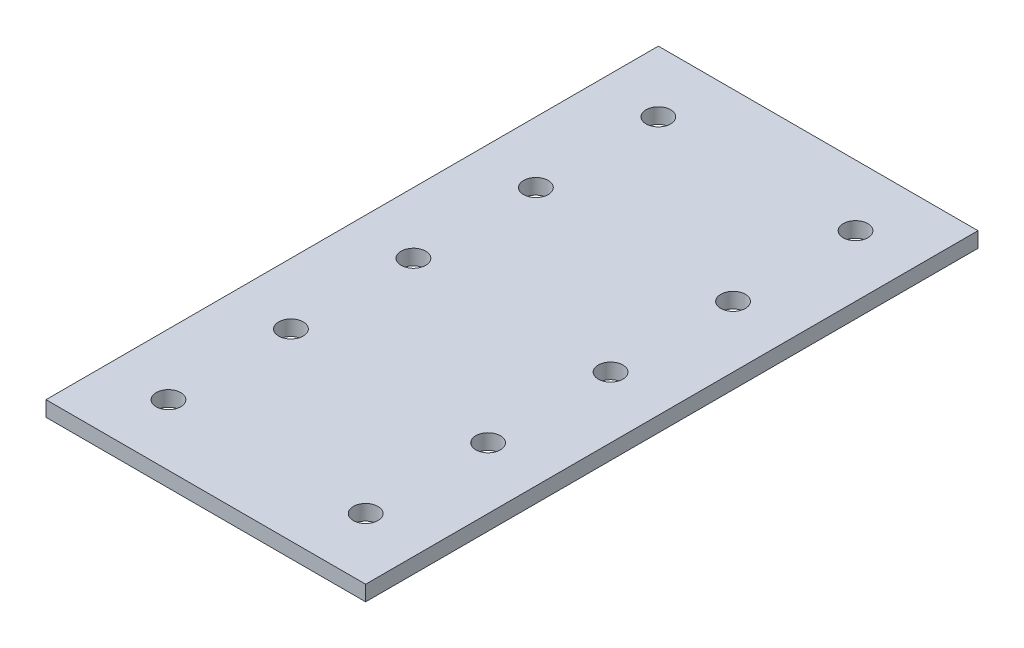
ISO-10303-21;
HEADER;
FILE_DESCRIPTION(('STEP AP214'),'2;1');
FILE_NAME('part.step','',(''),(''),'','','');
FILE_SCHEMA(('AUTOMOTIVE_DESIGN { 1 0 10303 214 1 1 1 1 }'));
ENDSEC;
DATA;
#1=APPLICATION_CONTEXT('core data for automotive mechanical design processes');
#2=APPLICATION_PROTOCOL_DEFINITION('international standard','automotive_design',2000,#1);
#3=PRODUCT_CONTEXT('',#1,'mechanical');
#4=PRODUCT('Part','Part','',(#3));
#5=PRODUCT_RELATED_PRODUCT_CATEGORY('part','',(#4));
#6=PRODUCT_DEFINITION_FORMATION('','',#4);
#7=PRODUCT_DEFINITION_CONTEXT('part definition',#1,'design');
#8=PRODUCT_DEFINITION('design','',#6,#7);
#9=PRODUCT_DEFINITION_SHAPE('','',#8);
#10=(LENGTH_UNIT() NAMED_UNIT(*) SI_UNIT(.MILLI.,.METRE.));
#11=(NAMED_UNIT(*) PLANE_ANGLE_UNIT() SI_UNIT($,.RADIAN.));
#12=(NAMED_UNIT(*) SI_UNIT($,.STERADIAN.) SOLID_ANGLE_UNIT());
#13=UNCERTAINTY_MEASURE_WITH_UNIT(LENGTH_MEASURE(1.E-05),#10,'distance_accuracy_value','');
#14=(GEOMETRIC_REPRESENTATION_CONTEXT(3) GLOBAL_UNCERTAINTY_ASSIGNED_CONTEXT((#13)) GLOBAL_UNIT_ASSIGNED_CONTEXT((#10,
#11,#12)) REPRESENTATION_CONTEXT('',''));
#15=CARTESIAN_POINT('',(0.,0.,0.));
#16=DIRECTION('',(0.,0.,1.));
#17=DIRECTION('',(1.,0.,0.));
#18=AXIS2_PLACEMENT_3D('',#15,#16,#17);
#19=CARTESIAN_POINT('',(20.447,0.,-50.8));
#20=DIRECTION('',(0.,1.,0.));
#21=DIRECTION('',(0.,0.,1.));
#22=AXIS2_PLACEMENT_3D('',#19,#20,#21);
#23=CYLINDRICAL_SURFACE('',#22,2.5527);
#24=CARTESIAN_POINT('',(20.447,0.,-50.8));
#25=DIRECTION('',(0.,1.,0.));
#26=DIRECTION('',(0.,0.,1.));
#27=AXIS2_PLACEMENT_3D('',#24,#25,#26);
#28=CIRCLE('',#27,2.5527);
#29=CARTESIAN_POINT('',(20.447,0.,-48.2473));
#30=VERTEX_POINT('',#29);
#31=EDGE_CURVE('E45',#30,#30,#28,.T.);
#32=ORIENTED_EDGE('',*,*,#31,.F.);
#33=EDGE_LOOP('',(#32));
#34=FACE_BOUND('',#33,.T.);
#35=CARTESIAN_POINT('',(20.447,3.175,-50.8));
#36=DIRECTION('',(0.,1.,0.));
#37=DIRECTION('',(0.,0.,1.));
#38=AXIS2_PLACEMENT_3D('',#35,#36,#37);
#39=CIRCLE('',#38,2.5527);
#40=CARTESIAN_POINT('',(20.447,3.175,-48.2473));
#41=VERTEX_POINT('',#40);
#42=EDGE_CURVE('E11',#41,#41,#39,.T.);
#43=ORIENTED_EDGE('',*,*,#42,.T.);
#44=EDGE_LOOP('',(#43));
#45=FACE_BOUND('',#44,.T.);
#46=ADVANCED_FACE('F37',(#34,#45),#23,.F.);
#47=CARTESIAN_POINT('',(-20.447,0.,-50.8));
#48=DIRECTION('',(0.,1.,0.));
#49=DIRECTION('',(0.,0.,1.));
#50=AXIS2_PLACEMENT_3D('',#47,#48,#49);
#51=CYLINDRICAL_SURFACE('',#50,2.5527);
#52=CARTESIAN_POINT('',(-20.447,0.,-50.8));
#53=DIRECTION('',(0.,1.,0.));
#54=DIRECTION('',(0.,0.,1.));
#55=AXIS2_PLACEMENT_3D('',#52,#53,#54);
#56=CIRCLE('',#55,2.5527);
#57=CARTESIAN_POINT('',(-20.447,0.,-48.2473));
#58=VERTEX_POINT('',#57);
#59=EDGE_CURVE('E151',#58,#58,#56,.T.);
#60=ORIENTED_EDGE('',*,*,#59,.F.);
#61=EDGE_LOOP('',(#60));
#62=FACE_BOUND('',#61,.T.);
#63=CARTESIAN_POINT('',(-20.447,3.175,-50.8));
#64=DIRECTION('',(0.,1.,0.));
#65=DIRECTION('',(0.,0.,1.));
#66=AXIS2_PLACEMENT_3D('',#63,#64,#65);
#67=CIRCLE('',#66,2.5527);
#68=CARTESIAN_POINT('',(-20.447,3.175,-48.2473));
#69=VERTEX_POINT('',#68);
#70=EDGE_CURVE('E154',#69,#69,#67,.T.);
#71=ORIENTED_EDGE('',*,*,#70,.T.);
#72=EDGE_LOOP('',(#71));
#73=FACE_BOUND('',#72,.T.);
#74=ADVANCED_FACE('F163',(#62,#73),#51,.F.);
#75=CARTESIAN_POINT('',(20.447,0.,-25.4));
#76=DIRECTION('',(0.,1.,0.));
#77=DIRECTION('',(0.,0.,1.));
#78=AXIS2_PLACEMENT_3D('',#75,#76,#77);
#79=CYLINDRICAL_SURFACE('',#78,2.5527);
#80=CARTESIAN_POINT('',(20.447,0.,-25.4));
#81=DIRECTION('',(0.,1.,0.));
#82=DIRECTION('',(0.,0.,1.));
#83=AXIS2_PLACEMENT_3D('',#80,#81,#82);
#84=CIRCLE('',#83,2.5527);
#85=CARTESIAN_POINT('',(20.447,0.,-22.8473));
#86=VERTEX_POINT('',#85);
#87=EDGE_CURVE('E145',#86,#86,#84,.T.);
#88=ORIENTED_EDGE('',*,*,#87,.F.);
#89=EDGE_LOOP('',(#88));
#90=FACE_BOUND('',#89,.T.);
#91=CARTESIAN_POINT('',(20.447,3.175,-25.4));
#92=DIRECTION('',(0.,1.,0.));
#93=DIRECTION('',(0.,0.,1.));
#94=AXIS2_PLACEMENT_3D('',#91,#92,#93);
#95=CIRCLE('',#94,2.5527);
#96=CARTESIAN_POINT('',(20.447,3.175,-22.8473));
#97=VERTEX_POINT('',#96);
#98=EDGE_CURVE('E148',#97,#97,#95,.T.);
#99=ORIENTED_EDGE('',*,*,#98,.T.);
#100=EDGE_LOOP('',(#99));
#101=FACE_BOUND('',#100,.T.);
#102=ADVANCED_FACE('F210',(#90,#101),#79,.F.);
#103=CARTESIAN_POINT('',(-20.447,0.,-25.4));
#104=DIRECTION('',(0.,1.,0.));
#105=DIRECTION('',(0.,0.,1.));
#106=AXIS2_PLACEMENT_3D('',#103,#104,#105);
#107=CYLINDRICAL_SURFACE('',#106,2.5527);
#108=CARTESIAN_POINT('',(-20.447,0.,-25.4));
#109=DIRECTION('',(0.,1.,0.));
#110=DIRECTION('',(0.,0.,1.));
#111=AXIS2_PLACEMENT_3D('',#108,#109,#110);
#112=CIRCLE('',#111,2.5527);
#113=CARTESIAN_POINT('',(-20.447,0.,-22.8473));
#114=VERTEX_POINT('',#113);
#115=EDGE_CURVE('E139',#114,#114,#112,.T.);
#116=ORIENTED_EDGE('',*,*,#115,.F.);
#117=EDGE_LOOP('',(#116));
#118=FACE_BOUND('',#117,.T.);
#119=CARTESIAN_POINT('',(-20.447,3.175,-25.4));
#120=DIRECTION('',(0.,1.,0.));
#121=DIRECTION('',(0.,0.,1.));
#122=AXIS2_PLACEMENT_3D('',#119,#120,#121);
#123=CIRCLE('',#122,2.5527);
#124=CARTESIAN_POINT('',(-20.447,3.175,-22.8473));
#125=VERTEX_POINT('',#124);
#126=EDGE_CURVE('E142',#125,#125,#123,.T.);
#127=ORIENTED_EDGE('',*,*,#126,.T.);
#128=EDGE_LOOP('',(#127));
#129=FACE_BOUND('',#128,.T.);
#130=ADVANCED_FACE('F206',(#118,#129),#107,.F.);
#131=CARTESIAN_POINT('',(20.447,0.,0.));
#132=DIRECTION('',(0.,1.,0.));
#133=DIRECTION('',(0.,0.,1.));
#134=AXIS2_PLACEMENT_3D('',#131,#132,#133);
#135=CYLINDRICAL_SURFACE('',#134,2.5527);
#136=CARTESIAN_POINT('',(20.447,0.,0.));
#137=DIRECTION('',(0.,1.,0.));
#138=DIRECTION('',(0.,0.,1.));
#139=AXIS2_PLACEMENT_3D('',#136,#137,#138);
#140=CIRCLE('',#139,2.5527);
#141=CARTESIAN_POINT('',(20.447,0.,2.5527));
#142=VERTEX_POINT('',#141);
#143=EDGE_CURVE('E133',#142,#142,#140,.T.);
#144=ORIENTED_EDGE('',*,*,#143,.F.);
#145=EDGE_LOOP('',(#144));
#146=FACE_BOUND('',#145,.T.);
#147=CARTESIAN_POINT('',(20.447,3.175,0.));
#148=DIRECTION('',(0.,1.,0.));
#149=DIRECTION('',(0.,0.,1.));
#150=AXIS2_PLACEMENT_3D('',#147,#148,#149);
#151=CIRCLE('',#150,2.5527);
#152=CARTESIAN_POINT('',(20.447,3.175,2.5527));
#153=VERTEX_POINT('',#152);
#154=EDGE_CURVE('E136',#153,#153,#151,.T.);
#155=ORIENTED_EDGE('',*,*,#154,.T.);
#156=EDGE_LOOP('',(#155));
#157=FACE_BOUND('',#156,.T.);
#158=ADVANCED_FACE('F202',(#146,#157),#135,.F.);
#159=CARTESIAN_POINT('',(-20.447,0.,0.));
#160=DIRECTION('',(0.,1.,0.));
#161=DIRECTION('',(0.,0.,1.));
#162=AXIS2_PLACEMENT_3D('',#159,#160,#161);
#163=CYLINDRICAL_SURFACE('',#162,2.5527);
#164=CARTESIAN_POINT('',(-20.447,0.,0.));
#165=DIRECTION('',(0.,1.,0.));
#166=DIRECTION('',(0.,0.,1.));
#167=AXIS2_PLACEMENT_3D('',#164,#165,#166);
#168=CIRCLE('',#167,2.5527);
#169=CARTESIAN_POINT('',(-20.447,0.,2.5527));
#170=VERTEX_POINT('',#169);
#171=EDGE_CURVE('E127',#170,#170,#168,.T.);
#172=ORIENTED_EDGE('',*,*,#171,.F.);
#173=EDGE_LOOP('',(#172));
#174=FACE_BOUND('',#173,.T.);
#175=CARTESIAN_POINT('',(-20.447,3.175,0.));
#176=DIRECTION('',(0.,1.,0.));
#177=DIRECTION('',(0.,0.,1.));
#178=AXIS2_PLACEMENT_3D('',#175,#176,#177);
#179=CIRCLE('',#178,2.5527);
#180=CARTESIAN_POINT('',(-20.447,3.175,2.5527));
#181=VERTEX_POINT('',#180);
#182=EDGE_CURVE('E130',#181,#181,#179,.T.);
#183=ORIENTED_EDGE('',*,*,#182,.T.);
#184=EDGE_LOOP('',(#183));
#185=FACE_BOUND('',#184,.T.);
#186=ADVANCED_FACE('F198',(#174,#185),#163,.F.);
#187=CARTESIAN_POINT('',(20.447,0.,25.4));
#188=DIRECTION('',(0.,1.,0.));
#189=DIRECTION('',(0.,0.,1.));
#190=AXIS2_PLACEMENT_3D('',#187,#188,#189);
#191=CYLINDRICAL_SURFACE('',#190,2.5527);
#192=CARTESIAN_POINT('',(20.447,0.,25.4));
#193=DIRECTION('',(0.,1.,0.));
#194=DIRECTION('',(0.,0.,1.));
#195=AXIS2_PLACEMENT_3D('',#192,#193,#194);
#196=CIRCLE('',#195,2.5527);
#197=CARTESIAN_POINT('',(20.447,0.,27.9527));
#198=VERTEX_POINT('',#197);
#199=EDGE_CURVE('E121',#198,#198,#196,.T.);
#200=ORIENTED_EDGE('',*,*,#199,.F.);
#201=EDGE_LOOP('',(#200));
#202=FACE_BOUND('',#201,.T.);
#203=CARTESIAN_POINT('',(20.447,3.175,25.4));
#204=DIRECTION('',(0.,1.,0.));
#205=DIRECTION('',(0.,0.,1.));
#206=AXIS2_PLACEMENT_3D('',#203,#204,#205);
#207=CIRCLE('',#206,2.5527);
#208=CARTESIAN_POINT('',(20.447,3.175,27.9527));
#209=VERTEX_POINT('',#208);
#210=EDGE_CURVE('E124',#209,#209,#207,.T.);
#211=ORIENTED_EDGE('',*,*,#210,.T.);
#212=EDGE_LOOP('',(#211));
#213=FACE_BOUND('',#212,.T.);
#214=ADVANCED_FACE('F194',(#202,#213),#191,.F.);
#215=CARTESIAN_POINT('',(-20.447,0.,25.4));
#216=DIRECTION('',(0.,1.,0.));
#217=DIRECTION('',(0.,0.,1.));
#218=AXIS2_PLACEMENT_3D('',#215,#216,#217);
#219=CYLINDRICAL_SURFACE('',#218,2.5527);
#220=CARTESIAN_POINT('',(-20.447,0.,25.4));
#221=DIRECTION('',(0.,1.,0.));
#222=DIRECTION('',(0.,0.,1.));
#223=AXIS2_PLACEMENT_3D('',#220,#221,#222);
#224=CIRCLE('',#223,2.5527);
#225=CARTESIAN_POINT('',(-20.447,0.,27.9527));
#226=VERTEX_POINT('',#225);
#227=EDGE_CURVE('E115',#226,#226,#224,.T.);
#228=ORIENTED_EDGE('',*,*,#227,.F.);
#229=EDGE_LOOP('',(#228));
#230=FACE_BOUND('',#229,.T.);
#231=CARTESIAN_POINT('',(-20.447,3.175,25.4));
#232=DIRECTION('',(0.,1.,0.));
#233=DIRECTION('',(0.,0.,1.));
#234=AXIS2_PLACEMENT_3D('',#231,#232,#233);
#235=CIRCLE('',#234,2.5527);
#236=CARTESIAN_POINT('',(-20.447,3.175,27.9527));
#237=VERTEX_POINT('',#236);
#238=EDGE_CURVE('E118',#237,#237,#235,.T.);
#239=ORIENTED_EDGE('',*,*,#238,.T.);
#240=EDGE_LOOP('',(#239));
#241=FACE_BOUND('',#240,.T.);
#242=ADVANCED_FACE('F190',(#230,#241),#219,.F.);
#243=CARTESIAN_POINT('',(33.147,3.175,63.5));
#244=DIRECTION('',(-1.,0.,0.));
#245=DIRECTION('',(0.,0.,1.));
#246=AXIS2_PLACEMENT_3D('',#243,#244,#245);
#247=PLANE('',#246);
#248=DIRECTION('',(0.,0.,-1.));
#249=VECTOR('',#248,1.);
#250=CARTESIAN_POINT('',(33.147,0.,63.5));
#251=LINE('',#250,#249);
#252=CARTESIAN_POINT('',(33.147,0.,63.5));
#253=VERTEX_POINT('',#252);
#254=CARTESIAN_POINT('',(33.147,0.,-63.5));
#255=VERTEX_POINT('',#254);
#256=EDGE_CURVE('E105',#253,#255,#251,.T.);
#257=ORIENTED_EDGE('',*,*,#256,.T.);
#258=DIRECTION('',(0.,-1.,0.));
#259=VECTOR('',#258,1.);
#260=CARTESIAN_POINT('',(33.147,3.175,-63.5));
#261=LINE('',#260,#259);
#262=CARTESIAN_POINT('',(33.147,3.175,-63.5));
#263=VERTEX_POINT('',#262);
#264=EDGE_CURVE('E96',#263,#255,#261,.T.);
#265=ORIENTED_EDGE('',*,*,#264,.F.);
#266=DIRECTION('',(0.,0.,-1.));
#267=VECTOR('',#266,1.);
#268=CARTESIAN_POINT('',(33.147,3.175,63.5));
#269=LINE('',#268,#267);
#270=CARTESIAN_POINT('',(33.147,3.175,63.5));
#271=VERTEX_POINT('',#270);
#272=EDGE_CURVE('E90',#271,#263,#269,.T.);
#273=ORIENTED_EDGE('',*,*,#272,.F.);
#274=DIRECTION('',(0.,-1.,0.));
#275=VECTOR('',#274,1.);
#276=CARTESIAN_POINT('',(33.147,3.175,63.5));
#277=LINE('',#276,#275);
#278=EDGE_CURVE('E101',#271,#253,#277,.T.);
#279=ORIENTED_EDGE('',*,*,#278,.T.);
#280=EDGE_LOOP('',(#257,#265,#273,#279));
#281=FACE_BOUND('',#280,.T.);
#282=ADVANCED_FACE('F187',(#281),#247,.F.);
#283=CARTESIAN_POINT('',(-33.147,3.175,-63.5));
#284=DIRECTION('',(0.,0.,1.));
#285=DIRECTION('',(1.,0.,0.));
#286=AXIS2_PLACEMENT_3D('',#283,#284,#285);
#287=PLANE('',#286);
#288=DIRECTION('',(-1.,0.,0.));
#289=VECTOR('',#288,1.);
#290=CARTESIAN_POINT('',(-33.147,0.,-63.5));
#291=LINE('',#290,#289);
#292=CARTESIAN_POINT('',(-33.147,0.,-63.5));
#293=VERTEX_POINT('',#292);
#294=EDGE_CURVE('E95',#255,#293,#291,.T.);
#295=ORIENTED_EDGE('',*,*,#294,.T.);
#296=DIRECTION('',(0.,-1.,0.));
#297=VECTOR('',#296,1.);
#298=CARTESIAN_POINT('',(-33.147,3.175,-63.5));
#299=LINE('',#298,#297);
#300=CARTESIAN_POINT('',(-33.147,3.175,-63.5));
#301=VERTEX_POINT('',#300);
#302=EDGE_CURVE('E93',#301,#293,#299,.T.);
#303=ORIENTED_EDGE('',*,*,#302,.F.);
#304=DIRECTION('',(-1.,0.,0.));
#305=VECTOR('',#304,1.);
#306=CARTESIAN_POINT('',(-33.147,3.175,-63.5));
#307=LINE('',#306,#305);
#308=EDGE_CURVE('E84',#263,#301,#307,.T.);
#309=ORIENTED_EDGE('',*,*,#308,.F.);
#310=ORIENTED_EDGE('',*,*,#264,.T.);
#311=EDGE_LOOP('',(#295,#303,#309,#310));
#312=FACE_BOUND('',#311,.T.);
#313=ADVANCED_FACE('F94',(#312),#287,.F.);
#314=CARTESIAN_POINT('',(-33.147,3.175,63.5));
#315=DIRECTION('',(1.,0.,0.));
#316=DIRECTION('',(0.,0.,-1.));
#317=AXIS2_PLACEMENT_3D('',#314,#315,#316);
#318=PLANE('',#317);
#319=DIRECTION('',(0.,0.,1.));
#320=VECTOR('',#319,1.);
#321=CARTESIAN_POINT('',(-33.147,0.,63.5));
#322=LINE('',#321,#320);
#323=CARTESIAN_POINT('',(-33.147,0.,63.5));
#324=VERTEX_POINT('',#323);
#325=EDGE_CURVE('E70',#293,#324,#322,.T.);
#326=ORIENTED_EDGE('',*,*,#325,.T.);
#327=DIRECTION('',(0.,-1.,0.));
#328=VECTOR('',#327,1.);
#329=CARTESIAN_POINT('',(-33.147,3.175,63.5));
#330=LINE('',#329,#328);
#331=CARTESIAN_POINT('',(-33.147,3.175,63.5));
#332=VERTEX_POINT('',#331);
#333=EDGE_CURVE('E97',#332,#324,#330,.T.);
#334=ORIENTED_EDGE('',*,*,#333,.F.);
#335=DIRECTION('',(0.,0.,1.));
#336=VECTOR('',#335,1.);
#337=CARTESIAN_POINT('',(-33.147,3.175,63.5));
#338=LINE('',#337,#336);
#339=EDGE_CURVE('E88',#301,#332,#338,.T.);
#340=ORIENTED_EDGE('',*,*,#339,.F.);
#341=ORIENTED_EDGE('',*,*,#302,.T.);
#342=EDGE_LOOP('',(#326,#334,#340,#341));
#343=FACE_BOUND('',#342,.T.);
#344=ADVANCED_FACE('F99',(#343),#318,.F.);
#345=CARTESIAN_POINT('',(-33.147,3.175,63.5));
#346=DIRECTION('',(0.,0.,-1.));
#347=DIRECTION('',(-1.,0.,0.));
#348=AXIS2_PLACEMENT_3D('',#345,#346,#347);
#349=PLANE('',#348);
#350=DIRECTION('',(1.,0.,0.));
#351=VECTOR('',#350,1.);
#352=CARTESIAN_POINT('',(-33.147,0.,63.5));
#353=LINE('',#352,#351);
#354=EDGE_CURVE('E76',#324,#253,#353,.T.);
#355=ORIENTED_EDGE('',*,*,#354,.T.);
#356=ORIENTED_EDGE('',*,*,#278,.F.);
#357=DIRECTION('',(1.,0.,0.));
#358=VECTOR('',#357,1.);
#359=CARTESIAN_POINT('',(-33.147,3.175,63.5));
#360=LINE('',#359,#358);
#361=EDGE_CURVE('E53',#332,#271,#360,.T.);
#362=ORIENTED_EDGE('',*,*,#361,.F.);
#363=ORIENTED_EDGE('',*,*,#333,.T.);
#364=EDGE_LOOP('',(#355,#356,#362,#363));
#365=FACE_BOUND('',#364,.T.);
#366=ADVANCED_FACE('F167',(#365),#349,.F.);
#367=CARTESIAN_POINT('',(0.,3.175,0.));
#368=DIRECTION('',(0.,-1.,0.));
#369=DIRECTION('',(0.,0.,-1.));
#370=AXIS2_PLACEMENT_3D('',#367,#368,#369);
#371=PLANE('',#370);
#372=CARTESIAN_POINT('',(20.447,3.175,50.8));
#373=DIRECTION('',(0.,1.,0.));
#374=DIRECTION('',(0.,0.,1.));
#375=AXIS2_PLACEMENT_3D('',#372,#373,#374);
#376=CIRCLE('',#375,2.5527);
#377=CARTESIAN_POINT('',(20.447,3.175,53.3527));
#378=VERTEX_POINT('',#377);
#379=EDGE_CURVE('E357',#378,#378,#376,.T.);
#380=ORIENTED_EDGE('',*,*,#379,.F.);
#381=EDGE_LOOP('',(#380));
#382=FACE_BOUND('',#381,.T.);
#383=CARTESIAN_POINT('',(-20.447,3.175,50.8));
#384=DIRECTION('',(0.,1.,0.));
#385=DIRECTION('',(0.,0.,1.));
#386=AXIS2_PLACEMENT_3D('',#383,#384,#385);
#387=CIRCLE('',#386,2.5527);
#388=CARTESIAN_POINT('',(-20.447,3.175,53.3527));
#389=VERTEX_POINT('',#388);
#390=EDGE_CURVE('E358',#389,#389,#387,.T.);
#391=ORIENTED_EDGE('',*,*,#390,.F.);
#392=EDGE_LOOP('',(#391));
#393=FACE_BOUND('',#392,.T.);
#394=ORIENTED_EDGE('',*,*,#272,.T.);
#395=ORIENTED_EDGE('',*,*,#308,.T.);
#396=ORIENTED_EDGE('',*,*,#339,.T.);
#397=ORIENTED_EDGE('',*,*,#361,.T.);
#398=EDGE_LOOP('',(#394,#395,#396,#397));
#399=FACE_BOUND('',#398,.T.);
#400=ORIENTED_EDGE('',*,*,#238,.F.);
#401=EDGE_LOOP('',(#400));
#402=FACE_BOUND('',#401,.T.);
#403=ORIENTED_EDGE('',*,*,#210,.F.);
#404=EDGE_LOOP('',(#403));
#405=FACE_BOUND('',#404,.T.);
#406=ORIENTED_EDGE('',*,*,#182,.F.);
#407=EDGE_LOOP('',(#406));
#408=FACE_BOUND('',#407,.T.);
#409=ORIENTED_EDGE('',*,*,#154,.F.);
#410=EDGE_LOOP('',(#409));
#411=FACE_BOUND('',#410,.T.);
#412=ORIENTED_EDGE('',*,*,#126,.F.);
#413=EDGE_LOOP('',(#412));
#414=FACE_BOUND('',#413,.T.);
#415=ORIENTED_EDGE('',*,*,#98,.F.);
#416=EDGE_LOOP('',(#415));
#417=FACE_BOUND('',#416,.T.);
#418=ORIENTED_EDGE('',*,*,#70,.F.);
#419=EDGE_LOOP('',(#418));
#420=FACE_BOUND('',#419,.T.);
#421=ORIENTED_EDGE('',*,*,#42,.F.);
#422=EDGE_LOOP('',(#421));
#423=FACE_BOUND('',#422,.T.);
#424=ADVANCED_FACE('F85',(#382,#393,#399,#402,#405,#408,#411,#414,#417,#420,#423),#371,.F.);
#425=CARTESIAN_POINT('',(0.,0.,0.));
#426=DIRECTION('',(0.,-1.,0.));
#427=DIRECTION('',(0.,0.,-1.));
#428=AXIS2_PLACEMENT_3D('',#425,#426,#427);
#429=PLANE('',#428);
#430=CARTESIAN_POINT('',(20.447,0.,50.8));
#431=DIRECTION('',(0.,1.,0.));
#432=DIRECTION('',(0.,0.,1.));
#433=AXIS2_PLACEMENT_3D('',#430,#431,#432);
#434=CIRCLE('',#433,2.5527);
#435=CARTESIAN_POINT('',(20.447,0.,53.3527));
#436=VERTEX_POINT('',#435);
#437=EDGE_CURVE('E355',#436,#436,#434,.T.);
#438=ORIENTED_EDGE('',*,*,#437,.T.);
#439=EDGE_LOOP('',(#438));
#440=FACE_BOUND('',#439,.T.);
#441=CARTESIAN_POINT('',(-20.447,0.,50.8));
#442=DIRECTION('',(0.,1.,0.));
#443=DIRECTION('',(0.,0.,1.));
#444=AXIS2_PLACEMENT_3D('',#441,#442,#443);
#445=CIRCLE('',#444,2.5527);
#446=CARTESIAN_POINT('',(-20.447,0.,53.3527));
#447=VERTEX_POINT('',#446);
#448=EDGE_CURVE('E108',#447,#447,#445,.T.);
#449=ORIENTED_EDGE('',*,*,#448,.T.);
#450=EDGE_LOOP('',(#449));
#451=FACE_BOUND('',#450,.T.);
#452=ORIENTED_EDGE('',*,*,#256,.F.);
#453=ORIENTED_EDGE('',*,*,#354,.F.);
#454=ORIENTED_EDGE('',*,*,#325,.F.);
#455=ORIENTED_EDGE('',*,*,#294,.F.);
#456=EDGE_LOOP('',(#452,#453,#454,#455));
#457=FACE_BOUND('',#456,.T.);
#458=ORIENTED_EDGE('',*,*,#227,.T.);
#459=EDGE_LOOP('',(#458));
#460=FACE_BOUND('',#459,.T.);
#461=ORIENTED_EDGE('',*,*,#199,.T.);
#462=EDGE_LOOP('',(#461));
#463=FACE_BOUND('',#462,.T.);
#464=ORIENTED_EDGE('',*,*,#171,.T.);
#465=EDGE_LOOP('',(#464));
#466=FACE_BOUND('',#465,.T.);
#467=ORIENTED_EDGE('',*,*,#143,.T.);
#468=EDGE_LOOP('',(#467));
#469=FACE_BOUND('',#468,.T.);
#470=ORIENTED_EDGE('',*,*,#115,.T.);
#471=EDGE_LOOP('',(#470));
#472=FACE_BOUND('',#471,.T.);
#473=ORIENTED_EDGE('',*,*,#87,.T.);
#474=EDGE_LOOP('',(#473));
#475=FACE_BOUND('',#474,.T.);
#476=ORIENTED_EDGE('',*,*,#59,.T.);
#477=EDGE_LOOP('',(#476));
#478=FACE_BOUND('',#477,.T.);
#479=ORIENTED_EDGE('',*,*,#31,.T.);
#480=EDGE_LOOP('',(#479));
#481=FACE_BOUND('',#480,.T.);
#482=ADVANCED_FACE('F159',(#440,#451,#457,#460,#463,#466,#469,#472,#475,#478,#481),#429,.T.);
#483=CARTESIAN_POINT('',(-20.447,0.,50.8));
#484=DIRECTION('',(0.,1.,0.));
#485=DIRECTION('',(0.,0.,1.));
#486=AXIS2_PLACEMENT_3D('',#483,#484,#485);
#487=CYLINDRICAL_SURFACE('',#486,2.5527);
#488=ORIENTED_EDGE('',*,*,#448,.F.);
#489=EDGE_LOOP('',(#488));
#490=FACE_BOUND('',#489,.T.);
#491=ORIENTED_EDGE('',*,*,#390,.T.);
#492=EDGE_LOOP('',(#491));
#493=FACE_BOUND('',#492,.T.);
#494=ADVANCED_FACE('F174',(#490,#493),#487,.F.);
#495=CARTESIAN_POINT('',(20.447,0.,50.8));
#496=DIRECTION('',(0.,1.,0.));
#497=DIRECTION('',(0.,0.,1.));
#498=AXIS2_PLACEMENT_3D('',#495,#496,#497);
#499=CYLINDRICAL_SURFACE('',#498,2.5527);
#500=ORIENTED_EDGE('',*,*,#437,.F.);
#501=EDGE_LOOP('',(#500));
#502=FACE_BOUND('',#501,.T.);
#503=ORIENTED_EDGE('',*,*,#379,.T.);
#504=EDGE_LOOP('',(#503));
#505=FACE_BOUND('',#504,.T.);
#506=ADVANCED_FACE('F275',(#502,#505),#499,.F.);
#507=CLOSED_SHELL('',(#46,#74,#102,#130,#158,#186,#214,#242,#282,#313,#344,#366,#424,#482,#494,#506));
#508=MANIFOLD_SOLID_BREP('B2',#507);
#509=ADVANCED_BREP_SHAPE_REPRESENTATION('',(#18,#508),#14);
#510=SHAPE_DEFINITION_REPRESENTATION(#9,#509);
ENDSEC;
END-ISO-10303-21;
